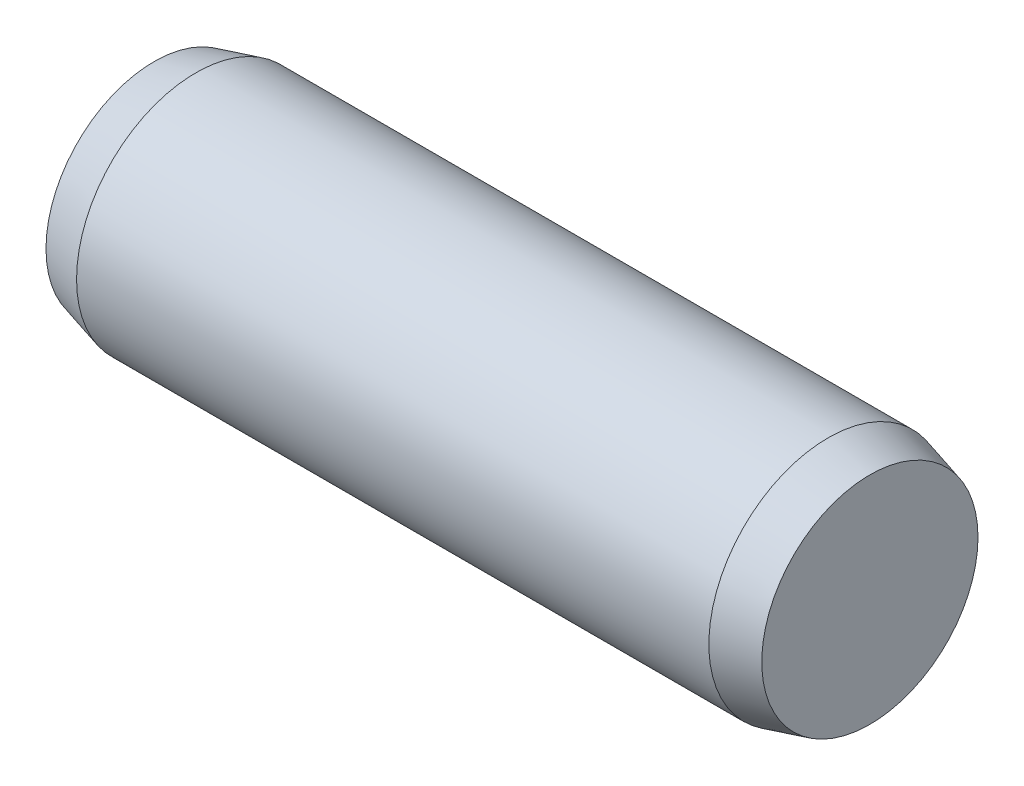
ISO-10303-21;
HEADER;
FILE_DESCRIPTION(('STEP AP214'),'2;1');
FILE_NAME('part.step','',(''),(''),'','','');
FILE_SCHEMA(('AUTOMOTIVE_DESIGN { 1 0 10303 214 1 1 1 1 }'));
ENDSEC;
DATA;
#1=APPLICATION_CONTEXT('core data for automotive mechanical design processes');
#2=APPLICATION_PROTOCOL_DEFINITION('international standard','automotive_design',2000,#1);
#3=PRODUCT_CONTEXT('',#1,'mechanical');
#4=PRODUCT('Part','Part','',(#3));
#5=PRODUCT_RELATED_PRODUCT_CATEGORY('part','',(#4));
#6=PRODUCT_DEFINITION_FORMATION('','',#4);
#7=PRODUCT_DEFINITION_CONTEXT('part definition',#1,'design');
#8=PRODUCT_DEFINITION('design','',#6,#7);
#9=PRODUCT_DEFINITION_SHAPE('','',#8);
#10=(LENGTH_UNIT() NAMED_UNIT(*) SI_UNIT(.MILLI.,.METRE.));
#11=(NAMED_UNIT(*) PLANE_ANGLE_UNIT() SI_UNIT($,.RADIAN.));
#12=(NAMED_UNIT(*) SI_UNIT($,.STERADIAN.) SOLID_ANGLE_UNIT());
#13=UNCERTAINTY_MEASURE_WITH_UNIT(LENGTH_MEASURE(1.E-05),#10,'distance_accuracy_value','');
#14=(GEOMETRIC_REPRESENTATION_CONTEXT(3) GLOBAL_UNCERTAINTY_ASSIGNED_CONTEXT((#13)) GLOBAL_UNIT_ASSIGNED_CONTEXT((#10,
#11,#12)) REPRESENTATION_CONTEXT('',''));
#15=CARTESIAN_POINT('',(0.,0.,0.));
#16=DIRECTION('',(0.,0.,1.));
#17=DIRECTION('',(1.,0.,0.));
#18=AXIS2_PLACEMENT_3D('',#15,#16,#17);
#19=CARTESIAN_POINT('',(-2.65,0.,0.));
#20=DIRECTION('',(1.,0.,0.));
#21=DIRECTION('',(0.,0.,-1.));
#22=AXIS2_PLACEMENT_3D('',#19,#20,#21);
#23=CYLINDRICAL_SURFACE('',#22,1.);
#24=CARTESIAN_POINT('',(-2.65,0.,0.));
#25=DIRECTION('',(-1.,0.,0.));
#26=DIRECTION('',(0.,0.,1.));
#27=AXIS2_PLACEMENT_3D('',#24,#25,#26);
#28=CIRCLE('',#27,1.);
#29=CARTESIAN_POINT('',(-2.65,0.,1.));
#30=VERTEX_POINT('',#29);
#31=EDGE_CURVE('E44',#30,#30,#28,.T.);
#32=ORIENTED_EDGE('',*,*,#31,.F.);
#33=EDGE_LOOP('',(#32));
#34=FACE_BOUND('',#33,.T.);
#35=CARTESIAN_POINT('',(2.65,0.,0.));
#36=DIRECTION('',(1.,0.,0.));
#37=DIRECTION('',(0.,0.,-1.));
#38=AXIS2_PLACEMENT_3D('',#35,#36,#37);
#39=CIRCLE('',#38,1.);
#40=CARTESIAN_POINT('',(2.65,0.,-1.));
#41=VERTEX_POINT('',#40);
#42=EDGE_CURVE('E10',#41,#41,#39,.T.);
#43=ORIENTED_EDGE('',*,*,#42,.F.);
#44=EDGE_LOOP('',(#43));
#45=FACE_BOUND('',#44,.T.);
#46=ADVANCED_FACE('F30',(#34,#45),#23,.T.);
#47=CARTESIAN_POINT('',(2.65,0.,0.));
#48=DIRECTION('',(-1.,0.,0.));
#49=DIRECTION('',(0.,0.,-1.));
#50=AXIS2_PLACEMENT_3D('',#47,#48,#49);
#51=CONICAL_SURFACE('',#50,1.,0.26179938779915);
#52=CARTESIAN_POINT('',(3.,0.,0.));
#53=DIRECTION('',(1.,0.,0.));
#54=DIRECTION('',(0.,0.,-1.));
#55=AXIS2_PLACEMENT_3D('',#52,#53,#54);
#56=CIRCLE('',#55,0.906217782649108);
#57=CARTESIAN_POINT('',(3.,0.,-0.906217782649108));
#58=VERTEX_POINT('',#57);
#59=EDGE_CURVE('E36',#58,#58,#56,.T.);
#60=ORIENTED_EDGE('',*,*,#59,.F.);
#61=EDGE_LOOP('',(#60));
#62=FACE_BOUND('',#61,.T.);
#63=ORIENTED_EDGE('',*,*,#42,.T.);
#64=EDGE_LOOP('',(#63));
#65=FACE_BOUND('',#64,.T.);
#66=ADVANCED_FACE('F54',(#62,#65),#51,.T.);
#67=CARTESIAN_POINT('',(3.,0.,0.));
#68=DIRECTION('',(1.,0.,0.));
#69=DIRECTION('',(0.,0.,-1.));
#70=AXIS2_PLACEMENT_3D('',#67,#68,#69);
#71=PLANE('',#70);
#72=ORIENTED_EDGE('',*,*,#59,.T.);
#73=EDGE_LOOP('',(#72));
#74=FACE_BOUND('',#73,.T.);
#75=ADVANCED_FACE('F58',(#74),#71,.T.);
#76=CARTESIAN_POINT('',(-2.65,0.,0.));
#77=DIRECTION('',(1.,0.,0.));
#78=DIRECTION('',(0.,0.,1.));
#79=AXIS2_PLACEMENT_3D('',#76,#77,#78);
#80=CONICAL_SURFACE('',#79,1.,0.26179938779915);
#81=CARTESIAN_POINT('',(-3.,0.,0.));
#82=DIRECTION('',(-1.,0.,0.));
#83=DIRECTION('',(0.,0.,1.));
#84=AXIS2_PLACEMENT_3D('',#81,#82,#83);
#85=CIRCLE('',#84,0.906217782649108);
#86=CARTESIAN_POINT('',(-3.,0.,0.906217782649108));
#87=VERTEX_POINT('',#86);
#88=EDGE_CURVE('E40',#87,#87,#85,.T.);
#89=ORIENTED_EDGE('',*,*,#88,.F.);
#90=EDGE_LOOP('',(#89));
#91=FACE_BOUND('',#90,.T.);
#92=ORIENTED_EDGE('',*,*,#31,.T.);
#93=EDGE_LOOP('',(#92));
#94=FACE_BOUND('',#93,.T.);
#95=ADVANCED_FACE('F50',(#91,#94),#80,.T.);
#96=CARTESIAN_POINT('',(-3.,0.,0.));
#97=DIRECTION('',(-1.,0.,0.));
#98=DIRECTION('',(0.,0.,1.));
#99=AXIS2_PLACEMENT_3D('',#96,#97,#98);
#100=PLANE('',#99);
#101=ORIENTED_EDGE('',*,*,#88,.T.);
#102=EDGE_LOOP('',(#101));
#103=FACE_BOUND('',#102,.T.);
#104=ADVANCED_FACE('F67',(#103),#100,.T.);
#105=CLOSED_SHELL('',(#46,#66,#75,#95,#104));
#106=MANIFOLD_SOLID_BREP('B2',#105);
#107=ADVANCED_BREP_SHAPE_REPRESENTATION('',(#18,#106),#14);
#108=SHAPE_DEFINITION_REPRESENTATION(#9,#107);
ENDSEC;
END-ISO-10303-21;
